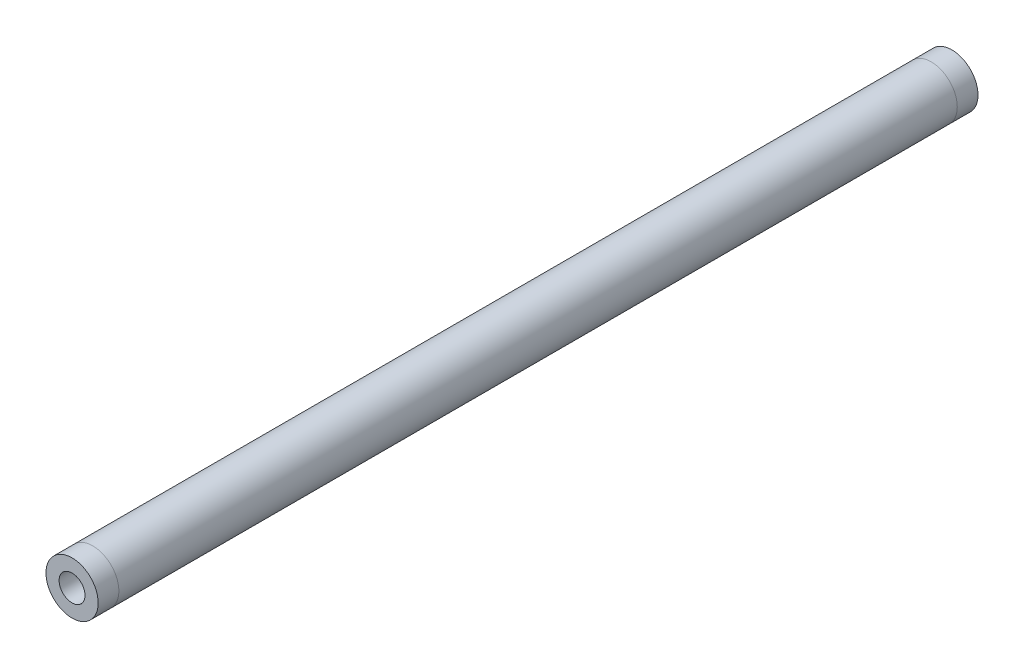
ISO-10303-21;
HEADER;
FILE_DESCRIPTION(('STEP AP214'),'2;1');
FILE_NAME('part.step','',(''),(''),'','','');
FILE_SCHEMA(('AUTOMOTIVE_DESIGN { 1 0 10303 214 1 1 1 1 }'));
ENDSEC;
DATA;
#1=APPLICATION_CONTEXT('core data for automotive mechanical design processes');
#2=APPLICATION_PROTOCOL_DEFINITION('international standard','automotive_design',2000,#1);
#3=PRODUCT_CONTEXT('',#1,'mechanical');
#4=PRODUCT('Part','Part','',(#3));
#5=PRODUCT_RELATED_PRODUCT_CATEGORY('part','',(#4));
#6=PRODUCT_DEFINITION_FORMATION('','',#4);
#7=PRODUCT_DEFINITION_CONTEXT('part definition',#1,'design');
#8=PRODUCT_DEFINITION('design','',#6,#7);
#9=PRODUCT_DEFINITION_SHAPE('','',#8);
#10=(LENGTH_UNIT() NAMED_UNIT(*) SI_UNIT(.MILLI.,.METRE.));
#11=(NAMED_UNIT(*) PLANE_ANGLE_UNIT() SI_UNIT($,.RADIAN.));
#12=(NAMED_UNIT(*) SI_UNIT($,.STERADIAN.) SOLID_ANGLE_UNIT());
#13=UNCERTAINTY_MEASURE_WITH_UNIT(LENGTH_MEASURE(1.E-05),#10,'distance_accuracy_value','');
#14=(GEOMETRIC_REPRESENTATION_CONTEXT(3) GLOBAL_UNCERTAINTY_ASSIGNED_CONTEXT((#13)) GLOBAL_UNIT_ASSIGNED_CONTEXT((#10,
#11,#12)) REPRESENTATION_CONTEXT('',''));
#15=CARTESIAN_POINT('',(0.,0.,0.));
#16=DIRECTION('',(0.,0.,1.));
#17=DIRECTION('',(1.,0.,0.));
#18=AXIS2_PLACEMENT_3D('',#15,#16,#17);
#19=CARTESIAN_POINT('',(0.,0.,-269.653958416907));
#20=DIRECTION('',(0.,0.,1.));
#21=DIRECTION('',(1.,0.,0.));
#22=AXIS2_PLACEMENT_3D('',#19,#20,#21);
#23=CYLINDRICAL_SURFACE('',#22,8.001);
#24=CARTESIAN_POINT('',(0.,0.,-269.653958416907));
#25=DIRECTION('',(0.,0.,1.));
#26=DIRECTION('',(1.,0.,0.));
#27=AXIS2_PLACEMENT_3D('',#24,#25,#26);
#28=CIRCLE('',#27,8.001);
#29=CARTESIAN_POINT('',(8.001,0.,-269.653958416907));
#30=VERTEX_POINT('',#29);
#31=EDGE_CURVE('E81',#30,#30,#28,.T.);
#32=ORIENTED_EDGE('',*,*,#31,.T.);
#33=EDGE_LOOP('',(#32));
#34=FACE_BOUND('',#33,.T.);
#35=CARTESIAN_POINT('',(0.,0.,-263.303958416907));
#36=DIRECTION('',(0.,0.,1.));
#37=DIRECTION('',(1.,0.,0.));
#38=AXIS2_PLACEMENT_3D('',#35,#36,#37);
#39=CIRCLE('',#38,8.001);
#40=CARTESIAN_POINT('',(8.001,0.,-263.303958416907));
#41=VERTEX_POINT('',#40);
#42=EDGE_CURVE('E77',#41,#41,#39,.T.);
#43=ORIENTED_EDGE('',*,*,#42,.F.);
#44=EDGE_LOOP('',(#43));
#45=FACE_BOUND('',#44,.T.);
#46=ADVANCED_FACE('F74',(#34,#45),#23,.T.);
#47=CARTESIAN_POINT('',(0.,0.,-269.653958416907));
#48=DIRECTION('',(0.,0.,1.));
#49=DIRECTION('',(1.,0.,0.));
#50=AXIS2_PLACEMENT_3D('',#47,#48,#49);
#51=PLANE('',#50);
#52=CARTESIAN_POINT('',(0.,0.,-269.653958416907));
#53=DIRECTION('',(0.,0.,1.));
#54=DIRECTION('',(1.,0.,0.));
#55=AXIS2_PLACEMENT_3D('',#52,#53,#54);
#56=CIRCLE('',#55,3.96875);
#57=CARTESIAN_POINT('',(3.96875,0.,-269.653958416907));
#58=VERTEX_POINT('',#57);
#59=EDGE_CURVE('E90',#58,#58,#56,.T.);
#60=ORIENTED_EDGE('',*,*,#59,.T.);
#61=EDGE_LOOP('',(#60));
#62=FACE_BOUND('',#61,.T.);
#63=ORIENTED_EDGE('',*,*,#31,.F.);
#64=EDGE_LOOP('',(#63));
#65=FACE_BOUND('',#64,.T.);
#66=ADVANCED_FACE('F117',(#62,#65),#51,.F.);
#67=CARTESIAN_POINT('',(0.,0.,-263.303958416907));
#68=DIRECTION('',(0.,0.,1.));
#69=DIRECTION('',(1.,0.,0.));
#70=AXIS2_PLACEMENT_3D('',#67,#68,#69);
#71=PLANE('',#70);
#72=CARTESIAN_POINT('',(0.,0.,-263.303958416907));
#73=DIRECTION('',(0.,0.,1.));
#74=DIRECTION('',(1.,0.,0.));
#75=AXIS2_PLACEMENT_3D('',#72,#73,#74);
#76=CIRCLE('',#75,6.477);
#77=CARTESIAN_POINT('',(-6.477,0.,-263.303958416907));
#78=VERTEX_POINT('',#77);
#79=EDGE_CURVE('E12',#78,#78,#76,.T.);
#80=ORIENTED_EDGE('',*,*,#79,.F.);
#81=EDGE_LOOP('',(#80));
#82=FACE_BOUND('',#81,.T.);
#83=ORIENTED_EDGE('',*,*,#42,.T.);
#84=EDGE_LOOP('',(#83));
#85=FACE_BOUND('',#84,.T.);
#86=ADVANCED_FACE('F113',(#82,#85),#71,.T.);
#87=CARTESIAN_POINT('',(0.,0.,-269.653958416907));
#88=DIRECTION('',(0.,0.,1.));
#89=DIRECTION('',(1.,0.,0.));
#90=AXIS2_PLACEMENT_3D('',#87,#88,#89);
#91=CYLINDRICAL_SURFACE('',#90,3.96875);
#92=ORIENTED_EDGE('',*,*,#59,.F.);
#93=EDGE_LOOP('',(#92));
#94=FACE_BOUND('',#93,.T.);
#95=CARTESIAN_POINT('',(0.,0.,-253.778958416907));
#96=DIRECTION('',(0.,0.,1.));
#97=DIRECTION('',(1.,0.,0.));
#98=AXIS2_PLACEMENT_3D('',#95,#96,#97);
#99=CIRCLE('',#98,3.96875);
#100=CARTESIAN_POINT('',(3.96875,0.,-253.778958416907));
#101=VERTEX_POINT('',#100);
#102=EDGE_CURVE('E96',#101,#101,#99,.T.);
#103=ORIENTED_EDGE('',*,*,#102,.T.);
#104=EDGE_LOOP('',(#103));
#105=FACE_BOUND('',#104,.T.);
#106=ADVANCED_FACE('F102',(#94,#105),#91,.F.);
#107=CARTESIAN_POINT('',(0.,0.,-253.778958416907));
#108=DIRECTION('',(0.,0.,1.));
#109=DIRECTION('',(1.,0.,0.));
#110=AXIS2_PLACEMENT_3D('',#107,#108,#109);
#111=PLANE('',#110);
#112=CARTESIAN_POINT('',(0.,0.,-253.778958416907));
#113=DIRECTION('',(0.,0.,1.));
#114=DIRECTION('',(1.,0.,0.));
#115=AXIS2_PLACEMENT_3D('',#112,#113,#114);
#116=CIRCLE('',#115,6.477);
#117=CARTESIAN_POINT('',(-6.477,0.,-253.778958416907));
#118=VERTEX_POINT('',#117);
#119=EDGE_CURVE('E88',#118,#118,#116,.T.);
#120=ORIENTED_EDGE('',*,*,#119,.T.);
#121=EDGE_LOOP('',(#120));
#122=FACE_BOUND('',#121,.T.);
#123=ORIENTED_EDGE('',*,*,#102,.F.);
#124=EDGE_LOOP('',(#123));
#125=FACE_BOUND('',#124,.T.);
#126=ADVANCED_FACE('F104',(#122,#125),#111,.T.);
#127=CARTESIAN_POINT('',(0.,0.,-253.778958416907));
#128=DIRECTION('',(0.,0.,-1.));
#129=DIRECTION('',(-1.,0.,0.));
#130=AXIS2_PLACEMENT_3D('',#127,#128,#129);
#131=CYLINDRICAL_SURFACE('',#130,6.477);
#132=CARTESIAN_POINT('',(-6.477,0.,-253.778958416907));
#133=CARTESIAN_POINT('',(-6.477,0.,-253.878177166907));
#134=CARTESIAN_POINT('',(-6.477,0.,-253.977395916907));
#135=CARTESIAN_POINT('',(-6.477,0.,-254.175833416907));
#136=CARTESIAN_POINT('',(-6.477,0.,-254.275052166907));
#137=CARTESIAN_POINT('',(-6.477,0.,-254.473489666907));
#138=CARTESIAN_POINT('',(-6.477,0.,-254.572708416907));
#139=CARTESIAN_POINT('',(-6.477,0.,-254.771145916907));
#140=CARTESIAN_POINT('',(-6.477,0.,-254.870364666907));
#141=CARTESIAN_POINT('',(-6.477,0.,-255.068802166907));
#142=CARTESIAN_POINT('',(-6.477,0.,-255.168020916907));
#143=CARTESIAN_POINT('',(-6.477,0.,-255.366458416907));
#144=CARTESIAN_POINT('',(-6.477,0.,-255.465677166907));
#145=CARTESIAN_POINT('',(-6.477,0.,-255.664114666907));
#146=CARTESIAN_POINT('',(-6.477,0.,-255.763333416907));
#147=CARTESIAN_POINT('',(-6.477,0.,-255.961770916907));
#148=CARTESIAN_POINT('',(-6.477,0.,-256.060989666907));
#149=CARTESIAN_POINT('',(-6.477,0.,-256.259427166907));
#150=CARTESIAN_POINT('',(-6.477,0.,-256.358645916907));
#151=CARTESIAN_POINT('',(-6.477,0.,-256.557083416907));
#152=CARTESIAN_POINT('',(-6.477,0.,-256.656302166907));
#153=CARTESIAN_POINT('',(-6.477,0.,-256.854739666907));
#154=CARTESIAN_POINT('',(-6.477,0.,-256.953958416907));
#155=CARTESIAN_POINT('',(-6.477,0.,-257.152395916907));
#156=CARTESIAN_POINT('',(-6.477,0.,-257.251614666907));
#157=CARTESIAN_POINT('',(-6.477,0.,-257.450052166907));
#158=CARTESIAN_POINT('',(-6.477,0.,-257.549270916907));
#159=CARTESIAN_POINT('',(-6.477,0.,-257.747708416907));
#160=CARTESIAN_POINT('',(-6.477,0.,-257.846927166907));
#161=CARTESIAN_POINT('',(-6.477,0.,-258.045364666907));
#162=CARTESIAN_POINT('',(-6.477,0.,-258.144583416907));
#163=CARTESIAN_POINT('',(-6.477,0.,-258.343020916907));
#164=CARTESIAN_POINT('',(-6.477,0.,-258.442239666907));
#165=CARTESIAN_POINT('',(-6.477,0.,-258.640677166907));
#166=CARTESIAN_POINT('',(-6.477,0.,-258.739895916907));
#167=CARTESIAN_POINT('',(-6.477,0.,-258.938333416907));
#168=CARTESIAN_POINT('',(-6.477,0.,-259.037552166907));
#169=CARTESIAN_POINT('',(-6.477,0.,-259.235989666907));
#170=CARTESIAN_POINT('',(-6.477,0.,-259.335208416907));
#171=CARTESIAN_POINT('',(-6.477,0.,-259.533645916907));
#172=CARTESIAN_POINT('',(-6.477,0.,-259.632864666907));
#173=CARTESIAN_POINT('',(-6.477,0.,-259.831302166907));
#174=CARTESIAN_POINT('',(-6.477,0.,-259.930520916907));
#175=CARTESIAN_POINT('',(-6.477,0.,-260.128958416907));
#176=CARTESIAN_POINT('',(-6.477,0.,-260.228177166907));
#177=CARTESIAN_POINT('',(-6.477,0.,-260.426614666907));
#178=CARTESIAN_POINT('',(-6.477,0.,-260.525833416907));
#179=CARTESIAN_POINT('',(-6.477,0.,-260.724270916907));
#180=CARTESIAN_POINT('',(-6.477,0.,-260.823489666907));
#181=CARTESIAN_POINT('',(-6.477,0.,-261.021927166907));
#182=CARTESIAN_POINT('',(-6.477,0.,-261.121145916907));
#183=CARTESIAN_POINT('',(-6.477,0.,-261.319583416907));
#184=CARTESIAN_POINT('',(-6.477,0.,-261.418802166907));
#185=CARTESIAN_POINT('',(-6.477,0.,-261.617239666907));
#186=CARTESIAN_POINT('',(-6.477,0.,-261.716458416907));
#187=CARTESIAN_POINT('',(-6.477,0.,-261.914895916907));
#188=CARTESIAN_POINT('',(-6.477,0.,-262.014114666907));
#189=CARTESIAN_POINT('',(-6.477,0.,-262.212552166907));
#190=CARTESIAN_POINT('',(-6.477,0.,-262.311770916907));
#191=CARTESIAN_POINT('',(-6.477,0.,-262.510208416907));
#192=CARTESIAN_POINT('',(-6.477,0.,-262.609427166907));
#193=CARTESIAN_POINT('',(-6.477,0.,-262.807864666907));
#194=CARTESIAN_POINT('',(-6.477,0.,-262.907083416907));
#195=CARTESIAN_POINT('',(-6.477,0.,-263.105520916907));
#196=CARTESIAN_POINT('',(-6.477,0.,-263.204739666907));
#197=CARTESIAN_POINT('',(-6.477,0.,-263.303958416907));
#198=B_SPLINE_CURVE_WITH_KNOTS('',3,(#132,#133,#134,#135,#136,#137,#138,#139,#140,#141,#142,
#143,#144,#145,#146,#147,#148,#149,#150,#151,#152,#153,#154,#155,#156,#157,#158,#159,#160,#161,
#162,#163,#164,#165,#166,#167,#168,#169,#170,#171,#172,#173,#174,#175,#176,#177,#178,#179,#180,
#181,#182,#183,#184,#185,#186,#187,#188,#189,#190,#191,#192,#193,#194,#195,#196,#197),
.UNSPECIFIED.,.F.,.F.,(4,2,2,2,2,2,2,2,2,2,2,2,2,2,2,2,2,2,2,2,2,2,2,2,2,2,2,2,2,2,2,2,4),(0.,
0.29765625,0.5953125,0.892968750000001,1.190625,1.48828125,1.7859375,2.08359375,2.38125,
2.67890625,2.9765625,3.27421875,3.571875,3.86953125,4.1671875,4.46484375,4.7625,5.06015625,
5.3578125,5.65546875,5.953125,6.25078125,6.5484375,6.84609375,7.14375,7.44140625,7.7390625,
8.03671875000001,8.334375,8.63203125,8.92968750000001,9.22734375000001,9.52500000000001),.UNSPECIFIED.);
#199=EDGE_CURVE('BSEAM106',#118,#78,#198,.T.);
#200=ORIENTED_EDGE('',*,*,#119,.F.);
#201=ORIENTED_EDGE('',*,*,#79,.T.);
#202=ORIENTED_EDGE('',*,*,#199,.T.);
#203=ORIENTED_EDGE('',*,*,#199,.F.);
#204=EDGE_LOOP('',(#200,#202,#201,#203));
#205=FACE_BOUND('',#204,.T.);
#206=ADVANCED_FACE('F106',(#205),#131,.T.);
#207=CLOSED_SHELL('',(#46,#66,#86,#106,#126,#206));
#208=MANIFOLD_SOLID_BREP('B2',#207);
#209=CARTESIAN_POINT('',(0.,0.,-263.303958416907));
#210=DIRECTION('',(0.,0.,1.));
#211=DIRECTION('',(1.,0.,0.));
#212=AXIS2_PLACEMENT_3D('',#209,#210,#211);
#213=CYLINDRICAL_SURFACE('',#212,8.001);
#214=CARTESIAN_POINT('',(0.,0.,-263.303958416907));
#215=DIRECTION('',(0.,0.,1.));
#216=DIRECTION('',(1.,0.,0.));
#217=AXIS2_PLACEMENT_3D('',#214,#215,#216);
#218=CIRCLE('',#217,8.001);
#219=CARTESIAN_POINT('',(8.001,0.,-263.303958416907));
#220=VERTEX_POINT('',#219);
#221=EDGE_CURVE('E73',#220,#220,#218,.T.);
#222=ORIENTED_EDGE('',*,*,#221,.T.);
#223=EDGE_LOOP('',(#222));
#224=FACE_BOUND('',#223,.T.);
#225=CARTESIAN_POINT('',(0.,0.,-6.35));
#226=DIRECTION('',(0.,0.,1.));
#227=DIRECTION('',(1.,0.,0.));
#228=AXIS2_PLACEMENT_3D('',#225,#226,#227);
#229=CIRCLE('',#228,8.001);
#230=CARTESIAN_POINT('',(8.001,0.,-6.35));
#231=VERTEX_POINT('',#230);
#232=EDGE_CURVE('E189',#231,#231,#229,.T.);
#233=ORIENTED_EDGE('',*,*,#232,.F.);
#234=EDGE_LOOP('',(#233));
#235=FACE_BOUND('',#234,.T.);
#236=ADVANCED_FACE('F186',(#224,#235),#213,.T.);
#237=CARTESIAN_POINT('',(0.,0.,-263.303958416907));
#238=DIRECTION('',(0.,0.,1.));
#239=DIRECTION('',(1.,0.,0.));
#240=AXIS2_PLACEMENT_3D('',#237,#238,#239);
#241=PLANE('',#240);
#242=CARTESIAN_POINT('',(0.,0.,-263.303958416907));
#243=DIRECTION('',(0.,0.,1.));
#244=DIRECTION('',(1.,0.,0.));
#245=AXIS2_PLACEMENT_3D('',#242,#243,#244);
#246=CIRCLE('',#245,6.477);
#247=CARTESIAN_POINT('',(6.477,0.,-263.303958416907));
#248=VERTEX_POINT('',#247);
#249=EDGE_CURVE('E196',#248,#248,#246,.T.);
#250=ORIENTED_EDGE('',*,*,#249,.T.);
#251=EDGE_LOOP('',(#250));
#252=FACE_BOUND('',#251,.T.);
#253=ORIENTED_EDGE('',*,*,#221,.F.);
#254=EDGE_LOOP('',(#253));
#255=FACE_BOUND('',#254,.T.);
#256=ADVANCED_FACE('F204',(#252,#255),#241,.F.);
#257=CARTESIAN_POINT('',(0.,0.,-6.35));
#258=DIRECTION('',(0.,0.,1.));
#259=DIRECTION('',(1.,0.,0.));
#260=AXIS2_PLACEMENT_3D('',#257,#258,#259);
#261=PLANE('',#260);
#262=CARTESIAN_POINT('',(0.,0.,-6.35));
#263=DIRECTION('',(0.,0.,1.));
#264=DIRECTION('',(1.,0.,0.));
#265=AXIS2_PLACEMENT_3D('',#262,#263,#264);
#266=CIRCLE('',#265,6.477);
#267=CARTESIAN_POINT('',(6.477,0.,-6.35));
#268=VERTEX_POINT('',#267);
#269=EDGE_CURVE('E198',#268,#268,#266,.T.);
#270=ORIENTED_EDGE('',*,*,#269,.F.);
#271=EDGE_LOOP('',(#270));
#272=FACE_BOUND('',#271,.T.);
#273=ORIENTED_EDGE('',*,*,#232,.T.);
#274=EDGE_LOOP('',(#273));
#275=FACE_BOUND('',#274,.T.);
#276=ADVANCED_FACE('F210',(#272,#275),#261,.T.);
#277=CARTESIAN_POINT('',(0.,0.,-263.303958416907));
#278=DIRECTION('',(0.,0.,1.));
#279=DIRECTION('',(1.,0.,0.));
#280=AXIS2_PLACEMENT_3D('',#277,#278,#279);
#281=CYLINDRICAL_SURFACE('',#280,6.477);
#282=ORIENTED_EDGE('',*,*,#249,.F.);
#283=EDGE_LOOP('',(#282));
#284=FACE_BOUND('',#283,.T.);
#285=ORIENTED_EDGE('',*,*,#269,.T.);
#286=EDGE_LOOP('',(#285));
#287=FACE_BOUND('',#286,.T.);
#288=ADVANCED_FACE('F207',(#284,#287),#281,.F.);
#289=CLOSED_SHELL('',(#236,#256,#276,#288));
#290=MANIFOLD_SOLID_BREP('B7',#289);
#291=CARTESIAN_POINT('',(0.,0.,-6.35));
#292=DIRECTION('',(0.,0.,1.));
#293=DIRECTION('',(1.,0.,0.));
#294=AXIS2_PLACEMENT_3D('',#291,#292,#293);
#295=CYLINDRICAL_SURFACE('',#294,8.001);
#296=CARTESIAN_POINT('',(0.,0.,-6.35));
#297=DIRECTION('',(0.,0.,1.));
#298=DIRECTION('',(1.,0.,0.));
#299=AXIS2_PLACEMENT_3D('',#296,#297,#298);
#300=CIRCLE('',#299,8.001);
#301=CARTESIAN_POINT('',(8.001,0.,-6.35));
#302=VERTEX_POINT('',#301);
#303=EDGE_CURVE('E185',#302,#302,#300,.T.);
#304=ORIENTED_EDGE('',*,*,#303,.T.);
#305=EDGE_LOOP('',(#304));
#306=FACE_BOUND('',#305,.T.);
#307=CARTESIAN_POINT('',(0.,0.,0.));
#308=DIRECTION('',(0.,0.,1.));
#309=DIRECTION('',(1.,0.,0.));
#310=AXIS2_PLACEMENT_3D('',#307,#308,#309);
#311=CIRCLE('',#310,8.001);
#312=CARTESIAN_POINT('',(8.001,0.,0.));
#313=VERTEX_POINT('',#312);
#314=EDGE_CURVE('E259',#313,#313,#311,.T.);
#315=ORIENTED_EDGE('',*,*,#314,.F.);
#316=EDGE_LOOP('',(#315));
#317=FACE_BOUND('',#316,.T.);
#318=ADVANCED_FACE('F248',(#306,#317),#295,.T.);
#319=CARTESIAN_POINT('',(0.,0.,-6.35));
#320=DIRECTION('',(0.,0.,1.));
#321=DIRECTION('',(1.,0.,0.));
#322=AXIS2_PLACEMENT_3D('',#319,#320,#321);
#323=CYLINDRICAL_SURFACE('',#322,3.96875);
#324=CARTESIAN_POINT('',(0.,0.,0.));
#325=DIRECTION('',(0.,0.,1.));
#326=DIRECTION('',(1.,0.,0.));
#327=AXIS2_PLACEMENT_3D('',#324,#325,#326);
#328=CIRCLE('',#327,3.96875);
#329=CARTESIAN_POINT('',(3.96875,0.,0.));
#330=VERTEX_POINT('',#329);
#331=EDGE_CURVE('E251',#330,#330,#328,.T.);
#332=ORIENTED_EDGE('',*,*,#331,.T.);
#333=EDGE_LOOP('',(#332));
#334=FACE_BOUND('',#333,.T.);
#335=CARTESIAN_POINT('',(0.,0.,-15.875));
#336=DIRECTION('',(0.,0.,1.));
#337=DIRECTION('',(1.,0.,0.));
#338=AXIS2_PLACEMENT_3D('',#335,#336,#337);
#339=CIRCLE('',#338,3.96875);
#340=CARTESIAN_POINT('',(3.96875,0.,-15.875));
#341=VERTEX_POINT('',#340);
#342=EDGE_CURVE('E271',#341,#341,#339,.T.);
#343=ORIENTED_EDGE('',*,*,#342,.F.);
#344=EDGE_LOOP('',(#343));
#345=FACE_BOUND('',#344,.T.);
#346=ADVANCED_FACE('F279',(#334,#345),#323,.F.);
#347=CARTESIAN_POINT('',(0.,0.,-6.35));
#348=DIRECTION('',(0.,0.,1.));
#349=DIRECTION('',(1.,0.,0.));
#350=AXIS2_PLACEMENT_3D('',#347,#348,#349);
#351=PLANE('',#350);
#352=CARTESIAN_POINT('',(0.,0.,-6.35));
#353=DIRECTION('',(0.,0.,1.));
#354=DIRECTION('',(1.,0.,0.));
#355=AXIS2_PLACEMENT_3D('',#352,#353,#354);
#356=CIRCLE('',#355,6.477);
#357=CARTESIAN_POINT('',(6.477,0.,-6.35));
#358=VERTEX_POINT('',#357);
#359=EDGE_CURVE('E261',#358,#358,#356,.T.);
#360=ORIENTED_EDGE('',*,*,#359,.T.);
#361=EDGE_LOOP('',(#360));
#362=FACE_BOUND('',#361,.T.);
#363=ORIENTED_EDGE('',*,*,#303,.F.);
#364=EDGE_LOOP('',(#363));
#365=FACE_BOUND('',#364,.T.);
#366=ADVANCED_FACE('F281',(#362,#365),#351,.F.);
#367=CARTESIAN_POINT('',(0.,0.,0.));
#368=DIRECTION('',(0.,0.,1.));
#369=DIRECTION('',(1.,0.,0.));
#370=AXIS2_PLACEMENT_3D('',#367,#368,#369);
#371=PLANE('',#370);
#372=ORIENTED_EDGE('',*,*,#314,.T.);
#373=EDGE_LOOP('',(#372));
#374=FACE_BOUND('',#373,.T.);
#375=ORIENTED_EDGE('',*,*,#331,.F.);
#376=EDGE_LOOP('',(#375));
#377=FACE_BOUND('',#376,.T.);
#378=ADVANCED_FACE('F287',(#374,#377),#371,.T.);
#379=CARTESIAN_POINT('',(0.,0.,-15.875));
#380=DIRECTION('',(0.,0.,1.));
#381=DIRECTION('',(1.,0.,0.));
#382=AXIS2_PLACEMENT_3D('',#379,#380,#381);
#383=CYLINDRICAL_SURFACE('',#382,6.477);
#384=CARTESIAN_POINT('',(0.,0.,-15.875));
#385=DIRECTION('',(0.,0.,1.));
#386=DIRECTION('',(1.,0.,0.));
#387=AXIS2_PLACEMENT_3D('',#384,#385,#386);
#388=CIRCLE('',#387,6.477);
#389=CARTESIAN_POINT('',(6.477,0.,-15.875));
#390=VERTEX_POINT('',#389);
#391=EDGE_CURVE('E264',#390,#390,#388,.T.);
#392=CARTESIAN_POINT('',(6.477,0.,-15.875));
#393=CARTESIAN_POINT('',(6.477,0.,-15.77578125));
#394=CARTESIAN_POINT('',(6.477,0.,-15.6765625));
#395=CARTESIAN_POINT('',(6.477,0.,-15.478125));
#396=CARTESIAN_POINT('',(6.477,0.,-15.37890625));
#397=CARTESIAN_POINT('',(6.477,0.,-15.18046875));
#398=CARTESIAN_POINT('',(6.477,0.,-15.08125));
#399=CARTESIAN_POINT('',(6.477,0.,-14.8828125));
#400=CARTESIAN_POINT('',(6.477,0.,-14.78359375));
#401=CARTESIAN_POINT('',(6.477,0.,-14.58515625));
#402=CARTESIAN_POINT('',(6.477,0.,-14.4859375));
#403=CARTESIAN_POINT('',(6.477,0.,-14.2875));
#404=CARTESIAN_POINT('',(6.477,0.,-14.18828125));
#405=CARTESIAN_POINT('',(6.477,0.,-13.98984375));
#406=CARTESIAN_POINT('',(6.477,0.,-13.890625));
#407=CARTESIAN_POINT('',(6.477,0.,-13.6921875));
#408=CARTESIAN_POINT('',(6.477,0.,-13.59296875));
#409=CARTESIAN_POINT('',(6.477,0.,-13.39453125));
#410=CARTESIAN_POINT('',(6.477,0.,-13.2953125));
#411=CARTESIAN_POINT('',(6.477,0.,-13.096875));
#412=CARTESIAN_POINT('',(6.477,0.,-12.99765625));
#413=CARTESIAN_POINT('',(6.477,0.,-12.79921875));
#414=CARTESIAN_POINT('',(6.477,0.,-12.7));
#415=CARTESIAN_POINT('',(6.477,0.,-12.5015625));
#416=CARTESIAN_POINT('',(6.477,0.,-12.40234375));
#417=CARTESIAN_POINT('',(6.477,0.,-12.20390625));
#418=CARTESIAN_POINT('',(6.477,0.,-12.1046875));
#419=CARTESIAN_POINT('',(6.477,0.,-11.90625));
#420=CARTESIAN_POINT('',(6.477,0.,-11.80703125));
#421=CARTESIAN_POINT('',(6.477,0.,-11.60859375));
#422=CARTESIAN_POINT('',(6.477,0.,-11.509375));
#423=CARTESIAN_POINT('',(6.477,0.,-11.3109375));
#424=CARTESIAN_POINT('',(6.477,0.,-11.21171875));
#425=CARTESIAN_POINT('',(6.477,0.,-11.01328125));
#426=CARTESIAN_POINT('',(6.477,0.,-10.9140625));
#427=CARTESIAN_POINT('',(6.477,0.,-10.715625));
#428=CARTESIAN_POINT('',(6.477,0.,-10.61640625));
#429=CARTESIAN_POINT('',(6.477,0.,-10.41796875));
#430=CARTESIAN_POINT('',(6.477,0.,-10.31875));
#431=CARTESIAN_POINT('',(6.477,0.,-10.1203125));
#432=CARTESIAN_POINT('',(6.477,0.,-10.02109375));
#433=CARTESIAN_POINT('',(6.477,0.,-9.82265625));
#434=CARTESIAN_POINT('',(6.477,0.,-9.7234375));
#435=CARTESIAN_POINT('',(6.477,0.,-9.525));
#436=CARTESIAN_POINT('',(6.477,0.,-9.42578125));
#437=CARTESIAN_POINT('',(6.477,0.,-9.22734375));
#438=CARTESIAN_POINT('',(6.477,0.,-9.128125));
#439=CARTESIAN_POINT('',(6.477,0.,-8.9296875));
#440=CARTESIAN_POINT('',(6.477,0.,-8.83046875));
#441=CARTESIAN_POINT('',(6.477,0.,-8.63203125));
#442=CARTESIAN_POINT('',(6.477,0.,-8.5328125));
#443=CARTESIAN_POINT('',(6.477,0.,-8.334375));
#444=CARTESIAN_POINT('',(6.477,0.,-8.23515625));
#445=CARTESIAN_POINT('',(6.477,0.,-8.03671875));
#446=CARTESIAN_POINT('',(6.477,0.,-7.9375));
#447=CARTESIAN_POINT('',(6.477,0.,-7.7390625));
#448=CARTESIAN_POINT('',(6.477,0.,-7.63984375));
#449=CARTESIAN_POINT('',(6.477,0.,-7.44140625));
#450=CARTESIAN_POINT('',(6.477,0.,-7.3421875));
#451=CARTESIAN_POINT('',(6.477,0.,-7.14375));
#452=CARTESIAN_POINT('',(6.477,0.,-7.04453125));
#453=CARTESIAN_POINT('',(6.477,0.,-6.84609375));
#454=CARTESIAN_POINT('',(6.477,0.,-6.746875));
#455=CARTESIAN_POINT('',(6.477,0.,-6.5484375));
#456=CARTESIAN_POINT('',(6.477,0.,-6.44921875));
#457=CARTESIAN_POINT('',(6.477,0.,-6.35));
#458=B_SPLINE_CURVE_WITH_KNOTS('',3,(#392,#393,#394,#395,#396,#397,#398,#399,#400,#401,#402,
#403,#404,#405,#406,#407,#408,#409,#410,#411,#412,#413,#414,#415,#416,#417,#418,#419,#420,#421,
#422,#423,#424,#425,#426,#427,#428,#429,#430,#431,#432,#433,#434,#435,#436,#437,#438,#439,#440,
#441,#442,#443,#444,#445,#446,#447,#448,#449,#450,#451,#452,#453,#454,#455,#456,#457),
.UNSPECIFIED.,.F.,.F.,(4,2,2,2,2,2,2,2,2,2,2,2,2,2,2,2,2,2,2,2,2,2,2,2,2,2,2,2,2,2,2,2,4),(0.,
0.297656250000002,0.595312500000002,0.892968750000002,1.190625,1.48828125,1.7859375,2.08359375,
2.38125,2.67890625,2.9765625,3.27421875,3.571875,3.86953125,4.1671875,4.46484375,4.7625,
5.06015625,5.3578125,5.65546875,5.953125,6.25078125,6.5484375,6.84609375,7.14375,7.44140625,
7.7390625,8.03671875,8.334375,8.63203125,8.9296875,9.22734375,9.525),.UNSPECIFIED.);
#459=EDGE_CURVE('BSEAM292',#390,#358,#458,.T.);
#460=ORIENTED_EDGE('',*,*,#391,.T.);
#461=ORIENTED_EDGE('',*,*,#359,.F.);
#462=ORIENTED_EDGE('',*,*,#459,.T.);
#463=ORIENTED_EDGE('',*,*,#459,.F.);
#464=EDGE_LOOP('',(#460,#462,#461,#463));
#465=FACE_BOUND('',#464,.T.);
#466=ADVANCED_FACE('F292',(#465),#383,.T.);
#467=CARTESIAN_POINT('',(0.,0.,-15.875));
#468=DIRECTION('',(0.,0.,1.));
#469=DIRECTION('',(1.,0.,0.));
#470=AXIS2_PLACEMENT_3D('',#467,#468,#469);
#471=PLANE('',#470);
#472=ORIENTED_EDGE('',*,*,#342,.T.);
#473=EDGE_LOOP('',(#472));
#474=FACE_BOUND('',#473,.T.);
#475=ORIENTED_EDGE('',*,*,#391,.F.);
#476=EDGE_LOOP('',(#475));
#477=FACE_BOUND('',#476,.T.);
#478=ADVANCED_FACE('F276',(#474,#477),#471,.F.);
#479=CLOSED_SHELL('',(#318,#346,#366,#378,#466,#478));
#480=MANIFOLD_SOLID_BREP('B68',#479);
#481=ADVANCED_BREP_SHAPE_REPRESENTATION('',(#18,#208,#290,#480),#14);
#482=SHAPE_DEFINITION_REPRESENTATION(#9,#481);
ENDSEC;
END-ISO-10303-21;
